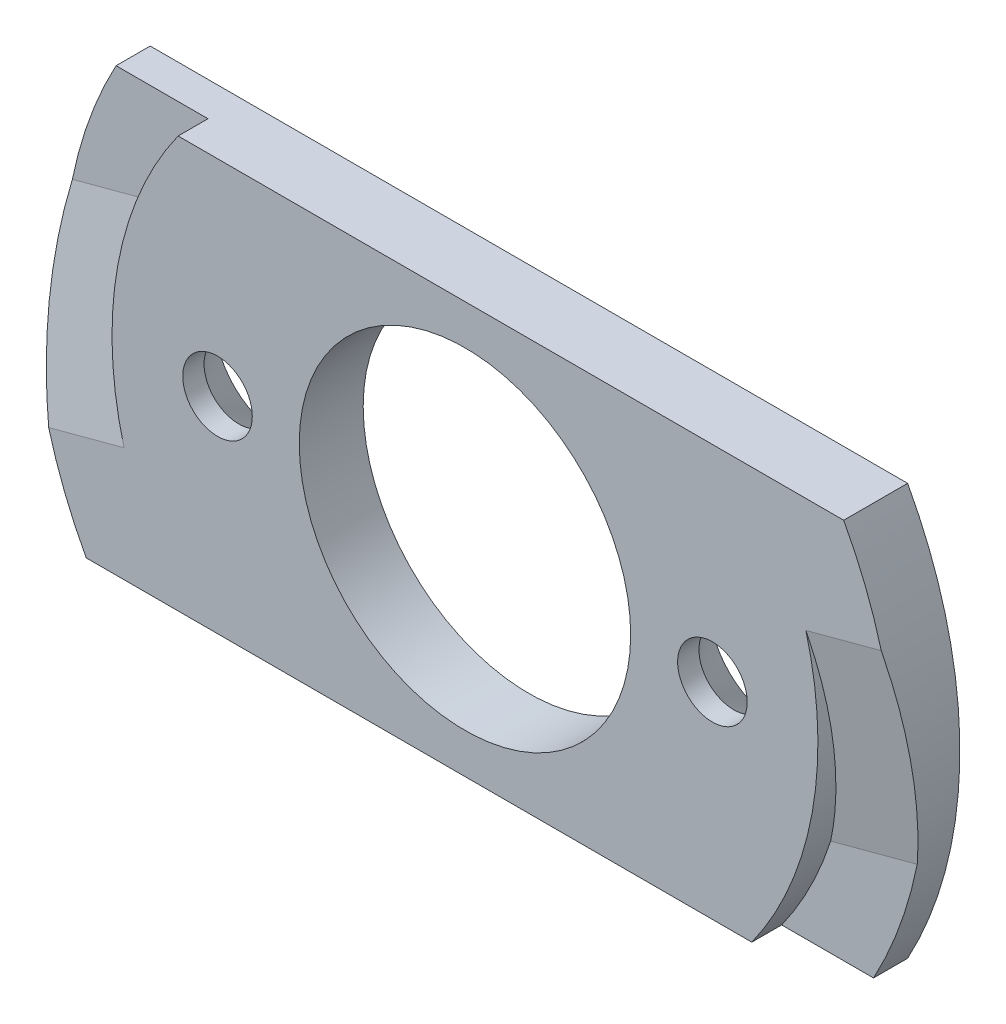
ISO-10303-21;
HEADER;
FILE_DESCRIPTION(('STEP AP214'),'2;1');
FILE_NAME('part.step','',(''),(''),'','','');
FILE_SCHEMA(('AUTOMOTIVE_DESIGN { 1 0 10303 214 1 1 1 1 }'));
ENDSEC;
DATA;
#1=APPLICATION_CONTEXT('core data for automotive mechanical design processes');
#2=APPLICATION_PROTOCOL_DEFINITION('international standard','automotive_design',2000,#1);
#3=PRODUCT_CONTEXT('',#1,'mechanical');
#4=PRODUCT('Part','Part','',(#3));
#5=PRODUCT_RELATED_PRODUCT_CATEGORY('part','',(#4));
#6=PRODUCT_DEFINITION_FORMATION('','',#4);
#7=PRODUCT_DEFINITION_CONTEXT('part definition',#1,'design');
#8=PRODUCT_DEFINITION('design','',#6,#7);
#9=PRODUCT_DEFINITION_SHAPE('','',#8);
#10=(LENGTH_UNIT() NAMED_UNIT(*) SI_UNIT(.MILLI.,.METRE.));
#11=(NAMED_UNIT(*) PLANE_ANGLE_UNIT() SI_UNIT($,.RADIAN.));
#12=(NAMED_UNIT(*) SI_UNIT($,.STERADIAN.) SOLID_ANGLE_UNIT());
#13=UNCERTAINTY_MEASURE_WITH_UNIT(LENGTH_MEASURE(1.E-05),#10,'distance_accuracy_value','');
#14=(GEOMETRIC_REPRESENTATION_CONTEXT(3) GLOBAL_UNCERTAINTY_ASSIGNED_CONTEXT((#13)) GLOBAL_UNIT_ASSIGNED_CONTEXT((#10,
#11,#12)) REPRESENTATION_CONTEXT('',''));
#15=CARTESIAN_POINT('',(0.,0.,0.));
#16=DIRECTION('',(0.,0.,1.));
#17=DIRECTION('',(1.,0.,0.));
#18=AXIS2_PLACEMENT_3D('',#15,#16,#17);
#19=CARTESIAN_POINT('',(0.,0.,3.));
#20=DIRECTION('',(0.,0.,-1.));
#21=DIRECTION('',(-1.,0.,0.));
#22=AXIS2_PLACEMENT_3D('',#19,#20,#21);
#23=CYLINDRICAL_SURFACE('',#22,16.56);
#24=CARTESIAN_POINT('',(0.,0.,1.6));
#25=DIRECTION('',(0.,0.,1.));
#26=DIRECTION('',(1.,0.,0.));
#27=AXIS2_PLACEMENT_3D('',#24,#25,#26);
#28=CIRCLE('',#27,16.56);
#29=CARTESIAN_POINT('',(13.4577524126431,-9.65,1.6));
#30=VERTEX_POINT('',#29);
#31=CARTESIAN_POINT('',(15.7565603608887,-5.09552799949839,1.6));
#32=VERTEX_POINT('',#31);
#33=EDGE_CURVE('E164',#30,#32,#28,.T.);
#34=ORIENTED_EDGE('',*,*,#33,.T.);
#35=CARTESIAN_POINT('',(0.,0.,3.00000000000006));
#36=DIRECTION('',(-0.0397823005914427,0.148469567049241,-0.988116468954881));
#37=DIRECTION('',(0.255743360944978,-0.95444721674508,-0.153707006281877));
#38=AXIS2_PLACEMENT_3D('',#35,#36,#37);
#39=ELLIPSE('',#38,16.759157974075,16.56);
#40=CARTESIAN_POINT('',(15.995731683347,4.28604338689775,3.));
#41=VERTEX_POINT('',#40);
#42=EDGE_CURVE('E61',#32,#41,#39,.F.);
#43=ORIENTED_EDGE('',*,*,#42,.T.);
#44=CARTESIAN_POINT('',(0.,0.,3.));
#45=DIRECTION('',(0.,0.,1.));
#46=DIRECTION('',(1.,0.,0.));
#47=AXIS2_PLACEMENT_3D('',#44,#45,#46);
#48=CIRCLE('',#47,16.56);
#49=CARTESIAN_POINT('',(13.4577524126431,-9.65,3.));
#50=VERTEX_POINT('',#49);
#51=EDGE_CURVE('E176',#50,#41,#48,.T.);
#52=ORIENTED_EDGE('',*,*,#51,.F.);
#53=DIRECTION('',(0.,0.,-1.));
#54=VECTOR('',#53,1.);
#55=CARTESIAN_POINT('',(13.4577524126431,-9.65,3.));
#56=LINE('',#55,#54);
#57=EDGE_CURVE('E218',#50,#30,#56,.T.);
#58=ORIENTED_EDGE('',*,*,#57,.T.);
#59=EDGE_LOOP('',(#34,#43,#52,#58));
#60=FACE_BOUND('',#59,.T.);
#61=ADVANCED_FACE('F51',(#60),#23,.T.);
#62=CARTESIAN_POINT('',(0.,0.,3.));
#63=DIRECTION('',(0.,0.,-1.));
#64=DIRECTION('',(-1.,0.,0.));
#65=AXIS2_PLACEMENT_3D('',#62,#63,#64);
#66=CYLINDRICAL_SURFACE('',#65,20.22);
#67=CARTESIAN_POINT('',(0.,0.,3.));
#68=DIRECTION('',(0.,0.,1.));
#69=DIRECTION('',(1.,0.,0.));
#70=AXIS2_PLACEMENT_3D('',#67,#68,#69);
#71=CIRCLE('',#70,20.22);
#72=CARTESIAN_POINT('',(19.531020207565,5.23332109197298,3.));
#73=VERTEX_POINT('',#72);
#74=CARTESIAN_POINT('',(17.768677497214,9.65,3.));
#75=VERTEX_POINT('',#74);
#76=EDGE_CURVE('E185',#73,#75,#71,.T.);
#77=ORIENTED_EDGE('',*,*,#76,.F.);
#78=CARTESIAN_POINT('',(0.,0.,3.00000000000006));
#79=DIRECTION('',(-0.0397823005914427,0.148469567049241,-0.988116468954881));
#80=DIRECTION('',(0.255743360944978,-0.95444721674508,-0.153707006281877));
#81=AXIS2_PLACEMENT_3D('',#78,#79,#80);
#82=ELLIPSE('',#81,20.463174772693,20.22);
#83=CARTESIAN_POINT('',(19.8189889401926,-4.00700354236479,1.6));
#84=VERTEX_POINT('',#83);
#85=EDGE_CURVE('E11',#73,#84,#82,.T.);
#86=ORIENTED_EDGE('',*,*,#85,.T.);
#87=CARTESIAN_POINT('',(0.,0.,1.6));
#88=DIRECTION('',(0.,0.,1.));
#89=DIRECTION('',(1.,0.,0.));
#90=AXIS2_PLACEMENT_3D('',#87,#88,#89);
#91=CIRCLE('',#90,20.22);
#92=CARTESIAN_POINT('',(17.768677497214,-9.65,1.6));
#93=VERTEX_POINT('',#92);
#94=EDGE_CURVE('E170',#93,#84,#91,.T.);
#95=ORIENTED_EDGE('',*,*,#94,.F.);
#96=DIRECTION('',(0.,0.,-1.));
#97=VECTOR('',#96,1.);
#98=CARTESIAN_POINT('',(17.768677497214,-9.65,1.6));
#99=LINE('',#98,#97);
#100=CARTESIAN_POINT('',(17.768677497214,-9.65,0.));
#101=VERTEX_POINT('',#100);
#102=EDGE_CURVE('E161',#93,#101,#99,.T.);
#103=ORIENTED_EDGE('',*,*,#102,.T.);
#104=CARTESIAN_POINT('',(0.,0.,0.));
#105=DIRECTION('',(0.,0.,1.));
#106=DIRECTION('',(1.,0.,0.));
#107=AXIS2_PLACEMENT_3D('',#104,#105,#106);
#108=CIRCLE('',#107,20.22);
#109=CARTESIAN_POINT('',(17.768677497214,9.65,0.));
#110=VERTEX_POINT('',#109);
#111=EDGE_CURVE('E141',#101,#110,#108,.T.);
#112=ORIENTED_EDGE('',*,*,#111,.T.);
#113=DIRECTION('',(0.,0.,-1.));
#114=VECTOR('',#113,1.);
#115=CARTESIAN_POINT('',(17.768677497214,9.65,3.));
#116=LINE('',#115,#114);
#117=EDGE_CURVE('E241',#75,#110,#116,.T.);
#118=ORIENTED_EDGE('',*,*,#117,.F.);
#119=EDGE_LOOP('',(#77,#86,#95,#103,#112,#118));
#120=FACE_BOUND('',#119,.T.);
#121=ADVANCED_FACE('F286',(#120),#66,.T.);
#122=CARTESIAN_POINT('',(0.,9.65,3.));
#123=DIRECTION('',(0.,1.,0.));
#124=DIRECTION('',(-1.,0.,0.));
#125=AXIS2_PLACEMENT_3D('',#122,#123,#124);
#126=PLANE('',#125);
#127=ORIENTED_EDGE('',*,*,#117,.T.);
#128=DIRECTION('',(1.,0.,0.));
#129=VECTOR('',#128,1.);
#130=CARTESIAN_POINT('',(0.,9.65,0.));
#131=LINE('',#130,#129);
#132=CARTESIAN_POINT('',(-17.768677497214,9.65,0.));
#133=VERTEX_POINT('',#132);
#134=EDGE_CURVE('E136',#133,#110,#131,.T.);
#135=ORIENTED_EDGE('',*,*,#134,.F.);
#136=DIRECTION('',(0.,0.,-1.));
#137=VECTOR('',#136,1.);
#138=CARTESIAN_POINT('',(-17.768677497214,9.65,1.6));
#139=LINE('',#138,#137);
#140=CARTESIAN_POINT('',(-17.768677497214,9.65,1.6));
#141=VERTEX_POINT('',#140);
#142=EDGE_CURVE('E130',#141,#133,#139,.T.);
#143=ORIENTED_EDGE('',*,*,#142,.F.);
#144=DIRECTION('',(1.,0.,0.));
#145=VECTOR('',#144,1.);
#146=CARTESIAN_POINT('',(0.,9.65,1.6));
#147=LINE('',#146,#145);
#148=CARTESIAN_POINT('',(-13.4577524126431,9.65,1.6));
#149=VERTEX_POINT('',#148);
#150=EDGE_CURVE('E134',#141,#149,#147,.T.);
#151=ORIENTED_EDGE('',*,*,#150,.T.);
#152=DIRECTION('',(0.,0.,-1.));
#153=VECTOR('',#152,1.);
#154=CARTESIAN_POINT('',(-13.4577524126431,9.65,3.));
#155=LINE('',#154,#153);
#156=CARTESIAN_POINT('',(-13.4577524126431,9.65,3.));
#157=VERTEX_POINT('',#156);
#158=EDGE_CURVE('E238',#157,#149,#155,.T.);
#159=ORIENTED_EDGE('',*,*,#158,.F.);
#160=DIRECTION('',(1.,0.,0.));
#161=VECTOR('',#160,1.);
#162=CARTESIAN_POINT('',(0.,9.65,3.));
#163=LINE('',#162,#161);
#164=EDGE_CURVE('E188',#157,#75,#163,.T.);
#165=ORIENTED_EDGE('',*,*,#164,.T.);
#166=EDGE_LOOP('',(#127,#135,#143,#151,#159,#165));
#167=FACE_BOUND('',#166,.T.);
#168=ADVANCED_FACE('F132',(#167),#126,.T.);
#169=CARTESIAN_POINT('',(0.,0.,3.));
#170=DIRECTION('',(0.,0.,-1.));
#171=DIRECTION('',(-1.,0.,0.));
#172=AXIS2_PLACEMENT_3D('',#169,#170,#171);
#173=CYLINDRICAL_SURFACE('',#172,16.56);
#174=CARTESIAN_POINT('',(0.,0.,1.6));
#175=DIRECTION('',(0.,0.,1.));
#176=DIRECTION('',(1.,0.,0.));
#177=AXIS2_PLACEMENT_3D('',#174,#175,#176);
#178=CIRCLE('',#177,16.56);
#179=CARTESIAN_POINT('',(-15.7565603608887,5.09552799949839,1.6));
#180=VERTEX_POINT('',#179);
#181=EDGE_CURVE('E156',#149,#180,#178,.T.);
#182=ORIENTED_EDGE('',*,*,#181,.T.);
#183=CARTESIAN_POINT('',(0.,0.,3.00000000000006));
#184=DIRECTION('',(-0.0397823005914427,0.148469567049241,0.988116468954881));
#185=DIRECTION('',(-0.255743360944978,0.95444721674508,-0.153707006281877));
#186=AXIS2_PLACEMENT_3D('',#183,#184,#185);
#187=ELLIPSE('',#186,16.759157974075,16.56);
#188=CARTESIAN_POINT('',(-15.995731683347,-4.28604338689776,3.));
#189=VERTEX_POINT('',#188);
#190=EDGE_CURVE('E263',#180,#189,#187,.T.);
#191=ORIENTED_EDGE('',*,*,#190,.T.);
#192=CARTESIAN_POINT('',(0.,0.,3.));
#193=DIRECTION('',(0.,0.,1.));
#194=DIRECTION('',(1.,0.,0.));
#195=AXIS2_PLACEMENT_3D('',#192,#193,#194);
#196=CIRCLE('',#195,16.56);
#197=EDGE_CURVE('E192',#157,#189,#196,.T.);
#198=ORIENTED_EDGE('',*,*,#197,.F.);
#199=ORIENTED_EDGE('',*,*,#158,.T.);
#200=EDGE_LOOP('',(#182,#191,#198,#199));
#201=FACE_BOUND('',#200,.T.);
#202=ADVANCED_FACE('F337',(#201),#173,.T.);
#203=CARTESIAN_POINT('',(0.,0.,3.));
#204=DIRECTION('',(0.,0.,-1.));
#205=DIRECTION('',(-1.,0.,0.));
#206=AXIS2_PLACEMENT_3D('',#203,#204,#205);
#207=CYLINDRICAL_SURFACE('',#206,20.22);
#208=CARTESIAN_POINT('',(0.,0.,3.));
#209=DIRECTION('',(0.,0.,1.));
#210=DIRECTION('',(1.,0.,0.));
#211=AXIS2_PLACEMENT_3D('',#208,#209,#210);
#212=CIRCLE('',#211,20.22);
#213=CARTESIAN_POINT('',(-19.531020207565,-5.23332109197299,3.));
#214=VERTEX_POINT('',#213);
#215=CARTESIAN_POINT('',(-17.768677497214,-9.65,3.));
#216=VERTEX_POINT('',#215);
#217=EDGE_CURVE('E200',#214,#216,#212,.T.);
#218=ORIENTED_EDGE('',*,*,#217,.F.);
#219=CARTESIAN_POINT('',(0.,0.,3.00000000000006));
#220=DIRECTION('',(-0.0397823005914427,0.148469567049241,0.988116468954881));
#221=DIRECTION('',(-0.255743360944978,0.95444721674508,-0.153707006281877));
#222=AXIS2_PLACEMENT_3D('',#219,#220,#221);
#223=ELLIPSE('',#222,20.463174772693,20.22);
#224=CARTESIAN_POINT('',(-19.8189889401926,4.00700354236479,1.6));
#225=VERTEX_POINT('',#224);
#226=EDGE_CURVE('E147',#214,#225,#223,.F.);
#227=ORIENTED_EDGE('',*,*,#226,.T.);
#228=CARTESIAN_POINT('',(0.,0.,1.6));
#229=DIRECTION('',(0.,0.,1.));
#230=DIRECTION('',(1.,0.,0.));
#231=AXIS2_PLACEMENT_3D('',#228,#229,#230);
#232=CIRCLE('',#231,20.22);
#233=EDGE_CURVE('E142',#141,#225,#232,.T.);
#234=ORIENTED_EDGE('',*,*,#233,.F.);
#235=ORIENTED_EDGE('',*,*,#142,.T.);
#236=CARTESIAN_POINT('',(0.,0.,0.));
#237=DIRECTION('',(0.,0.,1.));
#238=DIRECTION('',(1.,0.,0.));
#239=AXIS2_PLACEMENT_3D('',#236,#237,#238);
#240=CIRCLE('',#239,20.22);
#241=CARTESIAN_POINT('',(-17.768677497214,-9.65,0.));
#242=VERTEX_POINT('',#241);
#243=EDGE_CURVE('E224',#133,#242,#240,.T.);
#244=ORIENTED_EDGE('',*,*,#243,.T.);
#245=DIRECTION('',(0.,0.,-1.));
#246=VECTOR('',#245,1.);
#247=CARTESIAN_POINT('',(-17.768677497214,-9.65,3.));
#248=LINE('',#247,#246);
#249=EDGE_CURVE('E235',#216,#242,#248,.T.);
#250=ORIENTED_EDGE('',*,*,#249,.F.);
#251=EDGE_LOOP('',(#218,#227,#234,#235,#244,#250));
#252=FACE_BOUND('',#251,.T.);
#253=ADVANCED_FACE('F145',(#252),#207,.T.);
#254=CARTESIAN_POINT('',(0.,0.,3.));
#255=DIRECTION('',(0.,0.,-1.));
#256=DIRECTION('',(-1.,0.,0.));
#257=AXIS2_PLACEMENT_3D('',#254,#255,#256);
#258=CYLINDRICAL_SURFACE('',#257,7.775);
#259=CARTESIAN_POINT('',(0.,0.,3.));
#260=DIRECTION('',(0.,0.,1.));
#261=DIRECTION('',(1.,0.,0.));
#262=AXIS2_PLACEMENT_3D('',#259,#260,#261);
#263=CIRCLE('',#262,7.775);
#264=CARTESIAN_POINT('',(7.775,0.,3.));
#265=VERTEX_POINT('',#264);
#266=EDGE_CURVE('E210',#265,#265,#263,.T.);
#267=ORIENTED_EDGE('',*,*,#266,.T.);
#268=EDGE_LOOP('',(#267));
#269=FACE_BOUND('',#268,.T.);
#270=CARTESIAN_POINT('',(0.,0.,0.));
#271=DIRECTION('',(0.,0.,1.));
#272=DIRECTION('',(1.,0.,0.));
#273=AXIS2_PLACEMENT_3D('',#270,#271,#272);
#274=CIRCLE('',#273,7.775);
#275=CARTESIAN_POINT('',(7.775,0.,0.));
#276=VERTEX_POINT('',#275);
#277=EDGE_CURVE('E181',#276,#276,#274,.T.);
#278=ORIENTED_EDGE('',*,*,#277,.F.);
#279=EDGE_LOOP('',(#278));
#280=FACE_BOUND('',#279,.T.);
#281=ADVANCED_FACE('F326',(#269,#280),#258,.F.);
#282=CARTESIAN_POINT('',(11.61,0.,3.));
#283=DIRECTION('',(0.,0.,-1.));
#284=DIRECTION('',(-1.,0.,0.));
#285=AXIS2_PLACEMENT_3D('',#282,#283,#284);
#286=CYLINDRICAL_SURFACE('',#285,1.6319499986664);
#287=CARTESIAN_POINT('',(11.61,0.,2.00000000000001));
#288=DIRECTION('',(0.,0.,1.));
#289=DIRECTION('',(1.,0.,0.));
#290=AXIS2_PLACEMENT_3D('',#287,#288,#289);
#291=CIRCLE('',#290,1.6319499986664);
#292=CARTESIAN_POINT('',(13.2419499986664,0.,2.00000000000001));
#293=VERTEX_POINT('',#292);
#294=EDGE_CURVE('E252',#293,#293,#291,.F.);
#295=ORIENTED_EDGE('',*,*,#294,.T.);
#296=EDGE_LOOP('',(#295));
#297=FACE_BOUND('',#296,.T.);
#298=CARTESIAN_POINT('',(11.61,0.,3.));
#299=DIRECTION('',(0.,0.,1.));
#300=DIRECTION('',(1.,0.,0.));
#301=AXIS2_PLACEMENT_3D('',#298,#299,#300);
#302=CIRCLE('',#301,1.6319499986664);
#303=CARTESIAN_POINT('',(13.2419499986664,0.,3.));
#304=VERTEX_POINT('',#303);
#305=EDGE_CURVE('E206',#304,#304,#302,.T.);
#306=ORIENTED_EDGE('',*,*,#305,.T.);
#307=EDGE_LOOP('',(#306));
#308=FACE_BOUND('',#307,.T.);
#309=ADVANCED_FACE('F328',(#297,#308),#286,.F.);
#310=CARTESIAN_POINT('',(0.,-9.65,3.));
#311=DIRECTION('',(0.,1.,0.));
#312=DIRECTION('',(-1.,0.,0.));
#313=AXIS2_PLACEMENT_3D('',#310,#311,#312);
#314=PLANE('',#313);
#315=DIRECTION('',(1.,0.,0.));
#316=VECTOR('',#315,1.);
#317=CARTESIAN_POINT('',(0.,-9.65,0.));
#318=LINE('',#317,#316);
#319=EDGE_CURVE('E227',#242,#101,#318,.T.);
#320=ORIENTED_EDGE('',*,*,#319,.T.);
#321=ORIENTED_EDGE('',*,*,#102,.F.);
#322=DIRECTION('',(1.,0.,0.));
#323=VECTOR('',#322,1.);
#324=CARTESIAN_POINT('',(0.,-9.65,1.6));
#325=LINE('',#324,#323);
#326=EDGE_CURVE('E167',#30,#93,#325,.T.);
#327=ORIENTED_EDGE('',*,*,#326,.F.);
#328=ORIENTED_EDGE('',*,*,#57,.F.);
#329=DIRECTION('',(1.,0.,0.));
#330=VECTOR('',#329,1.);
#331=CARTESIAN_POINT('',(0.,-9.65,3.));
#332=LINE('',#331,#330);
#333=EDGE_CURVE('E203',#216,#50,#332,.T.);
#334=ORIENTED_EDGE('',*,*,#333,.F.);
#335=ORIENTED_EDGE('',*,*,#249,.T.);
#336=EDGE_LOOP('',(#320,#321,#327,#328,#334,#335));
#337=FACE_BOUND('',#336,.T.);
#338=ADVANCED_FACE('F334',(#337),#314,.F.);
#339=CARTESIAN_POINT('',(-11.61,0.,3.));
#340=DIRECTION('',(0.,0.,-1.));
#341=DIRECTION('',(-1.,0.,0.));
#342=AXIS2_PLACEMENT_3D('',#339,#340,#341);
#343=CYLINDRICAL_SURFACE('',#342,1.6319499986664);
#344=CARTESIAN_POINT('',(-11.61,0.,2.00000000000001));
#345=DIRECTION('',(0.,0.,1.));
#346=DIRECTION('',(1.,0.,0.));
#347=AXIS2_PLACEMENT_3D('',#344,#345,#346);
#348=CIRCLE('',#347,1.6319499986664);
#349=CARTESIAN_POINT('',(-9.9780500013336,0.,2.00000000000001));
#350=VERTEX_POINT('',#349);
#351=EDGE_CURVE('E256',#350,#350,#348,.F.);
#352=ORIENTED_EDGE('',*,*,#351,.T.);
#353=EDGE_LOOP('',(#352));
#354=FACE_BOUND('',#353,.T.);
#355=CARTESIAN_POINT('',(-11.61,0.,3.));
#356=DIRECTION('',(0.,0.,1.));
#357=DIRECTION('',(1.,0.,0.));
#358=AXIS2_PLACEMENT_3D('',#355,#356,#357);
#359=CIRCLE('',#358,1.6319499986664);
#360=CARTESIAN_POINT('',(-9.9780500013336,0.,3.));
#361=VERTEX_POINT('',#360);
#362=EDGE_CURVE('E214',#361,#361,#359,.T.);
#363=ORIENTED_EDGE('',*,*,#362,.T.);
#364=EDGE_LOOP('',(#363));
#365=FACE_BOUND('',#364,.T.);
#366=ADVANCED_FACE('F340',(#354,#365),#343,.F.);
#367=CARTESIAN_POINT('',(0.,0.,3.));
#368=DIRECTION('',(0.,0.,1.));
#369=DIRECTION('',(1.,0.,0.));
#370=AXIS2_PLACEMENT_3D('',#367,#368,#369);
#371=PLANE('',#370);
#372=ORIENTED_EDGE('',*,*,#51,.T.);
#373=DIRECTION('',(0.965925826289068,0.258819045102522,0.));
#374=VECTOR('',#373,1.);
#375=CARTESIAN_POINT('',(0.,0.,3.));
#376=LINE('',#375,#374);
#377=EDGE_CURVE('E180',#41,#73,#376,.T.);
#378=ORIENTED_EDGE('',*,*,#377,.T.);
#379=ORIENTED_EDGE('',*,*,#76,.T.);
#380=ORIENTED_EDGE('',*,*,#164,.F.);
#381=ORIENTED_EDGE('',*,*,#197,.T.);
#382=DIRECTION('',(0.965925826289068,0.258819045102522,0.));
#383=VECTOR('',#382,1.);
#384=CARTESIAN_POINT('',(0.,0.,3.));
#385=LINE('',#384,#383);
#386=EDGE_CURVE('E196',#214,#189,#385,.T.);
#387=ORIENTED_EDGE('',*,*,#386,.F.);
#388=ORIENTED_EDGE('',*,*,#217,.T.);
#389=ORIENTED_EDGE('',*,*,#333,.T.);
#390=EDGE_LOOP('',(#372,#378,#379,#380,#381,#387,#388,#389));
#391=FACE_BOUND('',#390,.T.);
#392=ORIENTED_EDGE('',*,*,#305,.F.);
#393=EDGE_LOOP('',(#392));
#394=FACE_BOUND('',#393,.T.);
#395=ORIENTED_EDGE('',*,*,#266,.F.);
#396=EDGE_LOOP('',(#395));
#397=FACE_BOUND('',#396,.T.);
#398=ORIENTED_EDGE('',*,*,#362,.F.);
#399=EDGE_LOOP('',(#398));
#400=FACE_BOUND('',#399,.T.);
#401=ADVANCED_FACE('F275',(#391,#394,#397,#400),#371,.T.);
#402=CARTESIAN_POINT('',(0.,0.,0.));
#403=DIRECTION('',(0.,0.,1.));
#404=DIRECTION('',(1.,0.,0.));
#405=AXIS2_PLACEMENT_3D('',#402,#403,#404);
#406=PLANE('',#405);
#407=CARTESIAN_POINT('',(11.61,0.,0.));
#408=DIRECTION('',(0.,0.,1.));
#409=DIRECTION('',(1.,0.,0.));
#410=AXIS2_PLACEMENT_3D('',#407,#408,#409);
#411=CIRCLE('',#410,3.13194999866641);
#412=CARTESIAN_POINT('',(14.7419499986664,0.,0.));
#413=VERTEX_POINT('',#412);
#414=EDGE_CURVE('E248',#413,#413,#411,.T.);
#415=ORIENTED_EDGE('',*,*,#414,.T.);
#416=EDGE_LOOP('',(#415));
#417=FACE_BOUND('',#416,.T.);
#418=CARTESIAN_POINT('',(-11.61,0.,0.));
#419=DIRECTION('',(0.,0.,1.));
#420=DIRECTION('',(1.,0.,0.));
#421=AXIS2_PLACEMENT_3D('',#418,#419,#420);
#422=CIRCLE('',#421,3.13194999866641);
#423=CARTESIAN_POINT('',(-8.47805000133359,0.,0.));
#424=VERTEX_POINT('',#423);
#425=EDGE_CURVE('E244',#424,#424,#422,.T.);
#426=ORIENTED_EDGE('',*,*,#425,.T.);
#427=EDGE_LOOP('',(#426));
#428=FACE_BOUND('',#427,.T.);
#429=ORIENTED_EDGE('',*,*,#111,.F.);
#430=ORIENTED_EDGE('',*,*,#319,.F.);
#431=ORIENTED_EDGE('',*,*,#243,.F.);
#432=ORIENTED_EDGE('',*,*,#134,.T.);
#433=EDGE_LOOP('',(#429,#430,#431,#432));
#434=FACE_BOUND('',#433,.T.);
#435=ORIENTED_EDGE('',*,*,#277,.T.);
#436=EDGE_LOOP('',(#435));
#437=FACE_BOUND('',#436,.T.);
#438=ADVANCED_FACE('F315',(#417,#428,#434,#437),#406,.F.);
#439=CARTESIAN_POINT('',(0.,0.,1.6));
#440=DIRECTION('',(0.,0.,1.));
#441=DIRECTION('',(1.,0.,0.));
#442=AXIS2_PLACEMENT_3D('',#439,#440,#441);
#443=PLANE('',#442);
#444=ORIENTED_EDGE('',*,*,#94,.T.);
#445=DIRECTION('',(-0.965925826289068,-0.258819045102521,0.));
#446=VECTOR('',#445,1.);
#447=CARTESIAN_POINT('',(2.3293714059227,-8.69333243660162,1.6));
#448=LINE('',#447,#446);
#449=EDGE_CURVE('E73',#84,#32,#448,.T.);
#450=ORIENTED_EDGE('',*,*,#449,.T.);
#451=ORIENTED_EDGE('',*,*,#33,.F.);
#452=ORIENTED_EDGE('',*,*,#326,.T.);
#453=EDGE_LOOP('',(#444,#450,#451,#452));
#454=FACE_BOUND('',#453,.T.);
#455=ADVANCED_FACE('F318',(#454),#443,.T.);
#456=CARTESIAN_POINT('',(0.,0.,1.6));
#457=DIRECTION('',(0.,0.,1.));
#458=DIRECTION('',(1.,0.,0.));
#459=AXIS2_PLACEMENT_3D('',#456,#457,#458);
#460=PLANE('',#459);
#461=ORIENTED_EDGE('',*,*,#233,.T.);
#462=DIRECTION('',(0.965925826289068,0.258819045102521,0.));
#463=VECTOR('',#462,1.);
#464=CARTESIAN_POINT('',(-18.3251030892697,4.40728904970387,1.6));
#465=LINE('',#464,#463);
#466=EDGE_CURVE('E260',#225,#180,#465,.T.);
#467=ORIENTED_EDGE('',*,*,#466,.T.);
#468=ORIENTED_EDGE('',*,*,#181,.F.);
#469=ORIENTED_EDGE('',*,*,#150,.F.);
#470=EDGE_LOOP('',(#461,#467,#468,#469));
#471=FACE_BOUND('',#470,.T.);
#472=ADVANCED_FACE('F154',(#471),#460,.T.);
#473=CARTESIAN_POINT('',(11.61,0.,0.));
#474=DIRECTION('',(0.,0.,-1.));
#475=DIRECTION('',(-1.,0.,0.));
#476=AXIS2_PLACEMENT_3D('',#473,#474,#475);
#477=CONICAL_SURFACE('',#476,3.13194999866641,0.643501108793283);
#478=ORIENTED_EDGE('',*,*,#294,.F.);
#479=EDGE_LOOP('',(#478));
#480=FACE_BOUND('',#479,.T.);
#481=ORIENTED_EDGE('',*,*,#414,.F.);
#482=EDGE_LOOP('',(#481));
#483=FACE_BOUND('',#482,.T.);
#484=ADVANCED_FACE('F294',(#480,#483),#477,.F.);
#485=CARTESIAN_POINT('',(-11.61,0.,0.));
#486=DIRECTION('',(0.,0.,-1.));
#487=DIRECTION('',(-1.,0.,0.));
#488=AXIS2_PLACEMENT_3D('',#485,#486,#487);
#489=CONICAL_SURFACE('',#488,3.13194999866641,0.643501108793283);
#490=ORIENTED_EDGE('',*,*,#351,.F.);
#491=EDGE_LOOP('',(#490));
#492=FACE_BOUND('',#491,.T.);
#493=ORIENTED_EDGE('',*,*,#425,.F.);
#494=EDGE_LOOP('',(#493));
#495=FACE_BOUND('',#494,.T.);
#496=ADVANCED_FACE('F283',(#492,#495),#489,.F.);
#497=CARTESIAN_POINT('',(-2.3293714059227,8.69333243660162,1.6));
#498=DIRECTION('',(-0.0397823005914427,0.148469567049241,0.988116468954881));
#499=DIRECTION('',(-0.965925826289068,-0.258819045102521,0.));
#500=AXIS2_PLACEMENT_3D('',#497,#498,#499);
#501=PLANE('',#500);
#502=ORIENTED_EDGE('',*,*,#226,.F.);
#503=ORIENTED_EDGE('',*,*,#386,.T.);
#504=ORIENTED_EDGE('',*,*,#190,.F.);
#505=ORIENTED_EDGE('',*,*,#466,.F.);
#506=EDGE_LOOP('',(#502,#503,#504,#505));
#507=FACE_BOUND('',#506,.T.);
#508=ADVANCED_FACE('F280',(#507),#501,.T.);
#509=CARTESIAN_POINT('',(0.,0.,3.00000000000006));
#510=DIRECTION('',(-0.0397823005914427,0.148469567049241,-0.988116468954881));
#511=DIRECTION('',(0.965925826289068,0.258819045102521,0.));
#512=AXIS2_PLACEMENT_3D('',#509,#510,#511);
#513=PLANE('',#512);
#514=ORIENTED_EDGE('',*,*,#42,.F.);
#515=ORIENTED_EDGE('',*,*,#449,.F.);
#516=ORIENTED_EDGE('',*,*,#85,.F.);
#517=ORIENTED_EDGE('',*,*,#377,.F.);
#518=EDGE_LOOP('',(#514,#515,#516,#517));
#519=FACE_BOUND('',#518,.T.);
#520=ADVANCED_FACE('F54',(#519),#513,.F.);
#521=CLOSED_SHELL('',(#61,#121,#168,#202,#253,#281,#309,#338,#366,#401,#438,#455,#472,#484,#496,
#508,#520));
#522=MANIFOLD_SOLID_BREP('B2',#521);
#523=ADVANCED_BREP_SHAPE_REPRESENTATION('',(#18,#522),#14);
#524=SHAPE_DEFINITION_REPRESENTATION(#9,#523);
ENDSEC;
END-ISO-10303-21;
